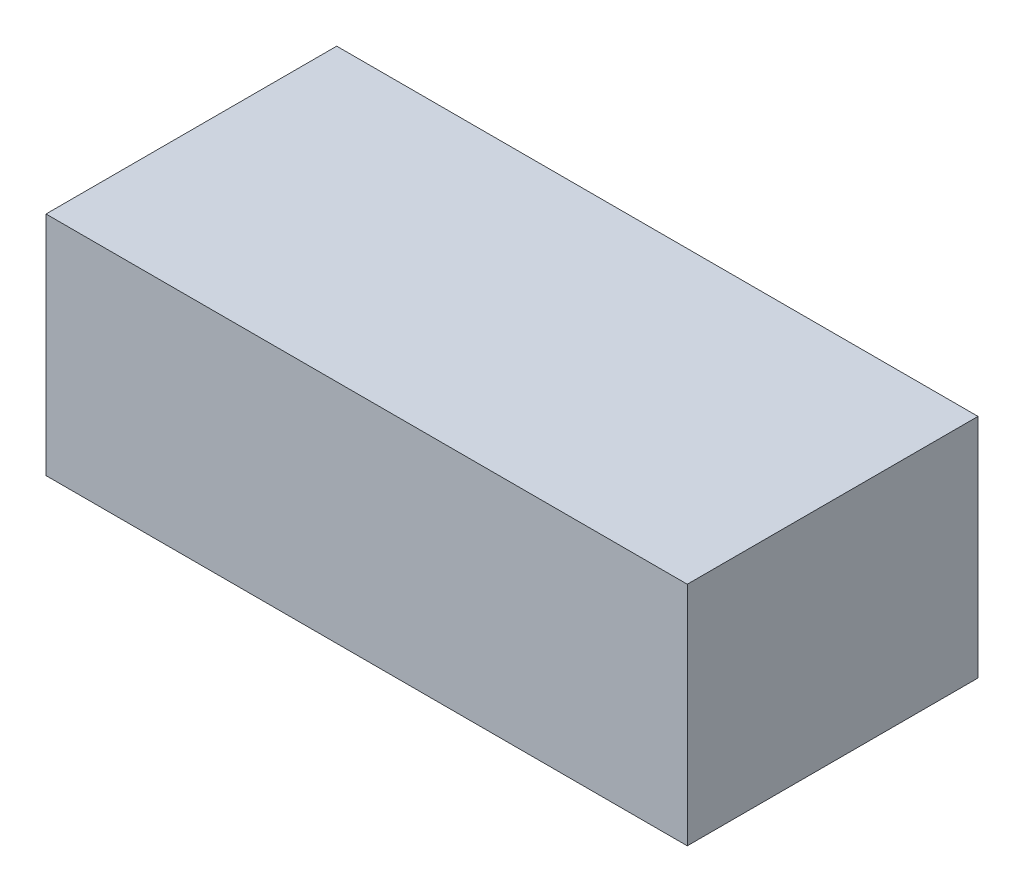
ISO-10303-21;
HEADER;
FILE_DESCRIPTION(('STEP AP214'),'2;1');
FILE_NAME('part.step','',(''),(''),'','','');
FILE_SCHEMA(('AUTOMOTIVE_DESIGN { 1 0 10303 214 1 1 1 1 }'));
ENDSEC;
DATA;
#1=APPLICATION_CONTEXT('core data for automotive mechanical design processes');
#2=APPLICATION_PROTOCOL_DEFINITION('international standard','automotive_design',2000,#1);
#3=PRODUCT_CONTEXT('',#1,'mechanical');
#4=PRODUCT('Part','Part','',(#3));
#5=PRODUCT_RELATED_PRODUCT_CATEGORY('part','',(#4));
#6=PRODUCT_DEFINITION_FORMATION('','',#4);
#7=PRODUCT_DEFINITION_CONTEXT('part definition',#1,'design');
#8=PRODUCT_DEFINITION('design','',#6,#7);
#9=PRODUCT_DEFINITION_SHAPE('','',#8);
#10=(LENGTH_UNIT() NAMED_UNIT(*) SI_UNIT(.MILLI.,.METRE.));
#11=(NAMED_UNIT(*) PLANE_ANGLE_UNIT() SI_UNIT($,.RADIAN.));
#12=(NAMED_UNIT(*) SI_UNIT($,.STERADIAN.) SOLID_ANGLE_UNIT());
#13=UNCERTAINTY_MEASURE_WITH_UNIT(LENGTH_MEASURE(1.E-05),#10,'distance_accuracy_value','');
#14=(GEOMETRIC_REPRESENTATION_CONTEXT(3) GLOBAL_UNCERTAINTY_ASSIGNED_CONTEXT((#13)) GLOBAL_UNIT_ASSIGNED_CONTEXT((#10,
#11,#12)) REPRESENTATION_CONTEXT('',''));
#15=CARTESIAN_POINT('',(0.,0.,0.));
#16=DIRECTION('',(0.,0.,1.));
#17=DIRECTION('',(1.,0.,0.));
#18=AXIS2_PLACEMENT_3D('',#15,#16,#17);
#19=CARTESIAN_POINT('',(-25.6688741721854,26.5,-15.5364238410596));
#20=DIRECTION('',(1.,0.,0.));
#21=DIRECTION('',(0.,0.,-1.));
#22=AXIS2_PLACEMENT_3D('',#19,#20,#21);
#23=PLANE('',#22);
#24=DIRECTION('',(0.,0.,1.));
#25=VECTOR('',#24,1.);
#26=CARTESIAN_POINT('',(-25.6688741721854,0.,-15.5364238410596));
#27=LINE('',#26,#25);
#28=CARTESIAN_POINT('',(-25.6688741721854,0.,-15.5364238410596));
#29=VERTEX_POINT('',#28);
#30=CARTESIAN_POINT('',(-25.6688741721854,0.,18.4635761589404));
#31=VERTEX_POINT('',#30);
#32=EDGE_CURVE('E113',#29,#31,#27,.T.);
#33=ORIENTED_EDGE('',*,*,#32,.T.);
#34=DIRECTION('',(0.,-1.,0.));
#35=VECTOR('',#34,1.);
#36=CARTESIAN_POINT('',(-25.6688741721854,26.5,18.4635761589404));
#37=LINE('',#36,#35);
#38=CARTESIAN_POINT('',(-25.6688741721854,26.5,18.4635761589404));
#39=VERTEX_POINT('',#38);
#40=EDGE_CURVE('E11',#39,#31,#37,.T.);
#41=ORIENTED_EDGE('',*,*,#40,.F.);
#42=DIRECTION('',(0.,0.,1.));
#43=VECTOR('',#42,1.);
#44=CARTESIAN_POINT('',(-25.6688741721854,26.5,-15.5364238410596));
#45=LINE('',#44,#43);
#46=CARTESIAN_POINT('',(-25.6688741721854,26.5,-15.5364238410596));
#47=VERTEX_POINT('',#46);
#48=EDGE_CURVE('E97',#47,#39,#45,.T.);
#49=ORIENTED_EDGE('',*,*,#48,.F.);
#50=DIRECTION('',(0.,-1.,0.));
#51=VECTOR('',#50,1.);
#52=CARTESIAN_POINT('',(-25.6688741721854,26.5,-15.5364238410596));
#53=LINE('',#52,#51);
#54=EDGE_CURVE('E109',#47,#29,#53,.T.);
#55=ORIENTED_EDGE('',*,*,#54,.T.);
#56=EDGE_LOOP('',(#33,#41,#49,#55));
#57=FACE_BOUND('',#56,.T.);
#58=ADVANCED_FACE('F45',(#57),#23,.F.);
#59=CARTESIAN_POINT('',(-25.6688741721854,26.5,18.4635761589404));
#60=DIRECTION('',(0.,0.,-1.));
#61=DIRECTION('',(-1.,0.,0.));
#62=AXIS2_PLACEMENT_3D('',#59,#60,#61);
#63=PLANE('',#62);
#64=DIRECTION('',(1.,0.,0.));
#65=VECTOR('',#64,1.);
#66=CARTESIAN_POINT('',(-25.6688741721854,0.,18.4635761589404));
#67=LINE('',#66,#65);
#68=CARTESIAN_POINT('',(49.3311258278146,0.,18.4635761589404));
#69=VERTEX_POINT('',#68);
#70=EDGE_CURVE('E102',#31,#69,#67,.T.);
#71=ORIENTED_EDGE('',*,*,#70,.T.);
#72=DIRECTION('',(0.,-1.,0.));
#73=VECTOR('',#72,1.);
#74=CARTESIAN_POINT('',(49.3311258278146,26.5,18.4635761589404));
#75=LINE('',#74,#73);
#76=CARTESIAN_POINT('',(49.3311258278146,26.5,18.4635761589404));
#77=VERTEX_POINT('',#76);
#78=EDGE_CURVE('E54',#77,#69,#75,.T.);
#79=ORIENTED_EDGE('',*,*,#78,.F.);
#80=DIRECTION('',(1.,0.,0.));
#81=VECTOR('',#80,1.);
#82=CARTESIAN_POINT('',(-25.6688741721854,26.5,18.4635761589404));
#83=LINE('',#82,#81);
#84=EDGE_CURVE('E92',#39,#77,#83,.T.);
#85=ORIENTED_EDGE('',*,*,#84,.F.);
#86=ORIENTED_EDGE('',*,*,#40,.T.);
#87=EDGE_LOOP('',(#71,#79,#85,#86));
#88=FACE_BOUND('',#87,.T.);
#89=ADVANCED_FACE('F101',(#88),#63,.F.);
#90=CARTESIAN_POINT('',(49.3311258278146,26.5,-15.5364238410596));
#91=DIRECTION('',(-1.,0.,0.));
#92=DIRECTION('',(0.,0.,1.));
#93=AXIS2_PLACEMENT_3D('',#90,#91,#92);
#94=PLANE('',#93);
#95=DIRECTION('',(0.,0.,-1.));
#96=VECTOR('',#95,1.);
#97=CARTESIAN_POINT('',(49.3311258278146,0.,-15.5364238410596));
#98=LINE('',#97,#96);
#99=CARTESIAN_POINT('',(49.3311258278146,0.,-15.5364238410596));
#100=VERTEX_POINT('',#99);
#101=EDGE_CURVE('E79',#69,#100,#98,.T.);
#102=ORIENTED_EDGE('',*,*,#101,.T.);
#103=DIRECTION('',(0.,-1.,0.));
#104=VECTOR('',#103,1.);
#105=CARTESIAN_POINT('',(49.3311258278146,26.5,-15.5364238410596));
#106=LINE('',#105,#104);
#107=CARTESIAN_POINT('',(49.3311258278146,26.5,-15.5364238410596));
#108=VERTEX_POINT('',#107);
#109=EDGE_CURVE('E104',#108,#100,#106,.T.);
#110=ORIENTED_EDGE('',*,*,#109,.F.);
#111=DIRECTION('',(0.,0.,-1.));
#112=VECTOR('',#111,1.);
#113=CARTESIAN_POINT('',(49.3311258278146,26.5,-15.5364238410596));
#114=LINE('',#113,#112);
#115=EDGE_CURVE('E95',#77,#108,#114,.T.);
#116=ORIENTED_EDGE('',*,*,#115,.F.);
#117=ORIENTED_EDGE('',*,*,#78,.T.);
#118=EDGE_LOOP('',(#102,#110,#116,#117));
#119=FACE_BOUND('',#118,.T.);
#120=ADVANCED_FACE('F105',(#119),#94,.F.);
#121=CARTESIAN_POINT('',(-25.6688741721854,26.5,-15.5364238410596));
#122=DIRECTION('',(0.,0.,1.));
#123=DIRECTION('',(1.,0.,0.));
#124=AXIS2_PLACEMENT_3D('',#121,#122,#123);
#125=PLANE('',#124);
#126=DIRECTION('',(-1.,0.,0.));
#127=VECTOR('',#126,1.);
#128=CARTESIAN_POINT('',(-25.6688741721854,0.,-15.5364238410596));
#129=LINE('',#128,#127);
#130=EDGE_CURVE('E85',#100,#29,#129,.T.);
#131=ORIENTED_EDGE('',*,*,#130,.T.);
#132=ORIENTED_EDGE('',*,*,#54,.F.);
#133=DIRECTION('',(-1.,0.,0.));
#134=VECTOR('',#133,1.);
#135=CARTESIAN_POINT('',(-25.6688741721854,26.5,-15.5364238410596));
#136=LINE('',#135,#134);
#137=EDGE_CURVE('E62',#108,#47,#136,.T.);
#138=ORIENTED_EDGE('',*,*,#137,.F.);
#139=ORIENTED_EDGE('',*,*,#109,.T.);
#140=EDGE_LOOP('',(#131,#132,#138,#139));
#141=FACE_BOUND('',#140,.T.);
#142=ADVANCED_FACE('F126',(#141),#125,.F.);
#143=CARTESIAN_POINT('',(0.,26.5,0.));
#144=DIRECTION('',(0.,1.,0.));
#145=DIRECTION('',(0.,0.,1.));
#146=AXIS2_PLACEMENT_3D('',#143,#144,#145);
#147=PLANE('',#146);
#148=ORIENTED_EDGE('',*,*,#48,.T.);
#149=ORIENTED_EDGE('',*,*,#84,.T.);
#150=ORIENTED_EDGE('',*,*,#115,.T.);
#151=ORIENTED_EDGE('',*,*,#137,.T.);
#152=EDGE_LOOP('',(#148,#149,#150,#151));
#153=FACE_BOUND('',#152,.T.);
#154=ADVANCED_FACE('F93',(#153),#147,.T.);
#155=CARTESIAN_POINT('',(0.,0.,0.));
#156=DIRECTION('',(0.,1.,0.));
#157=DIRECTION('',(0.,0.,1.));
#158=AXIS2_PLACEMENT_3D('',#155,#156,#157);
#159=PLANE('',#158);
#160=ORIENTED_EDGE('',*,*,#32,.F.);
#161=ORIENTED_EDGE('',*,*,#130,.F.);
#162=ORIENTED_EDGE('',*,*,#101,.F.);
#163=ORIENTED_EDGE('',*,*,#70,.F.);
#164=EDGE_LOOP('',(#160,#161,#162,#163));
#165=FACE_BOUND('',#164,.T.);
#166=ADVANCED_FACE('F129',(#165),#159,.F.);
#167=CLOSED_SHELL('',(#58,#89,#120,#142,#154,#166));
#168=MANIFOLD_SOLID_BREP('B2',#167);
#169=ADVANCED_BREP_SHAPE_REPRESENTATION('',(#18,#168),#14);
#170=SHAPE_DEFINITION_REPRESENTATION(#9,#169);
ENDSEC;
END-ISO-10303-21;
